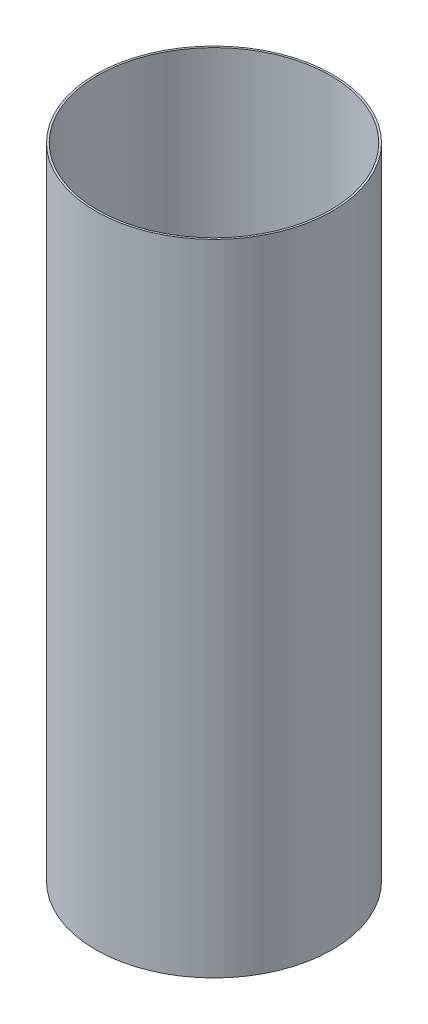
ISO-10303-21;
HEADER;
FILE_DESCRIPTION(('STEP AP214'),'2;1');
FILE_NAME('part.step','',(''),(''),'','','');
FILE_SCHEMA(('AUTOMOTIVE_DESIGN { 1 0 10303 214 1 1 1 1 }'));
ENDSEC;
DATA;
#1=APPLICATION_CONTEXT('core data for automotive mechanical design processes');
#2=APPLICATION_PROTOCOL_DEFINITION('international standard','automotive_design',2000,#1);
#3=PRODUCT_CONTEXT('',#1,'mechanical');
#4=PRODUCT('Part','Part','',(#3));
#5=PRODUCT_RELATED_PRODUCT_CATEGORY('part','',(#4));
#6=PRODUCT_DEFINITION_FORMATION('','',#4);
#7=PRODUCT_DEFINITION_CONTEXT('part definition',#1,'design');
#8=PRODUCT_DEFINITION('design','',#6,#7);
#9=PRODUCT_DEFINITION_SHAPE('','',#8);
#10=(LENGTH_UNIT() NAMED_UNIT(*) SI_UNIT(.MILLI.,.METRE.));
#11=(NAMED_UNIT(*) PLANE_ANGLE_UNIT() SI_UNIT($,.RADIAN.));
#12=(NAMED_UNIT(*) SI_UNIT($,.STERADIAN.) SOLID_ANGLE_UNIT());
#13=UNCERTAINTY_MEASURE_WITH_UNIT(LENGTH_MEASURE(1.E-05),#10,'distance_accuracy_value','');
#14=(GEOMETRIC_REPRESENTATION_CONTEXT(3) GLOBAL_UNCERTAINTY_ASSIGNED_CONTEXT((#13)) GLOBAL_UNIT_ASSIGNED_CONTEXT((#10,
#11,#12)) REPRESENTATION_CONTEXT('',''));
#15=CARTESIAN_POINT('',(0.,0.,0.));
#16=DIRECTION('',(0.,0.,1.));
#17=DIRECTION('',(1.,0.,0.));
#18=AXIS2_PLACEMENT_3D('',#15,#16,#17);
#19=CARTESIAN_POINT('',(0.,133.,0.));
#20=DIRECTION('',(0.,1.,0.));
#21=DIRECTION('',(0.,0.,1.));
#22=AXIS2_PLACEMENT_3D('',#19,#20,#21);
#23=PLANE('',#22);
#24=CARTESIAN_POINT('',(0.,133.,0.));
#25=DIRECTION('',(0.,1.,0.));
#26=DIRECTION('',(0.,0.,1.));
#27=AXIS2_PLACEMENT_3D('',#24,#25,#26);
#28=CIRCLE('',#27,24.63);
#29=CARTESIAN_POINT('',(0.,133.,24.63));
#30=VERTEX_POINT('',#29);
#31=EDGE_CURVE('E10',#30,#30,#28,.T.);
#32=ORIENTED_EDGE('',*,*,#31,.T.);
#33=EDGE_LOOP('',(#32));
#34=FACE_BOUND('',#33,.T.);
#35=CARTESIAN_POINT('',(0.,133.,0.));
#36=DIRECTION('',(0.,1.,0.));
#37=DIRECTION('',(0.,0.,1.));
#38=AXIS2_PLACEMENT_3D('',#35,#36,#37);
#39=CIRCLE('',#38,24.23);
#40=CARTESIAN_POINT('',(0.,133.,24.23));
#41=VERTEX_POINT('',#40);
#42=EDGE_CURVE('E52',#41,#41,#39,.T.);
#43=ORIENTED_EDGE('',*,*,#42,.F.);
#44=EDGE_LOOP('',(#43));
#45=FACE_BOUND('',#44,.T.);
#46=ADVANCED_FACE('F41',(#34,#45),#23,.T.);
#47=CARTESIAN_POINT('',(0.,0.,0.));
#48=DIRECTION('',(0.,1.,0.));
#49=DIRECTION('',(0.,0.,1.));
#50=AXIS2_PLACEMENT_3D('',#47,#48,#49);
#51=PLANE('',#50);
#52=CARTESIAN_POINT('',(0.,0.,0.));
#53=DIRECTION('',(0.,1.,0.));
#54=DIRECTION('',(0.,0.,1.));
#55=AXIS2_PLACEMENT_3D('',#52,#53,#54);
#56=CIRCLE('',#55,24.63);
#57=CARTESIAN_POINT('',(0.,0.,24.63));
#58=VERTEX_POINT('',#57);
#59=EDGE_CURVE('E45',#58,#58,#56,.T.);
#60=ORIENTED_EDGE('',*,*,#59,.F.);
#61=EDGE_LOOP('',(#60));
#62=FACE_BOUND('',#61,.T.);
#63=CARTESIAN_POINT('',(0.,0.,0.));
#64=DIRECTION('',(0.,1.,0.));
#65=DIRECTION('',(0.,0.,1.));
#66=AXIS2_PLACEMENT_3D('',#63,#64,#65);
#67=CIRCLE('',#66,24.23);
#68=CARTESIAN_POINT('',(0.,0.,24.23));
#69=VERTEX_POINT('',#68);
#70=EDGE_CURVE('E54',#69,#69,#67,.T.);
#71=ORIENTED_EDGE('',*,*,#70,.T.);
#72=EDGE_LOOP('',(#71));
#73=FACE_BOUND('',#72,.T.);
#74=ADVANCED_FACE('F64',(#62,#73),#51,.F.);
#75=CARTESIAN_POINT('',(0.,133.,0.));
#76=DIRECTION('',(0.,-1.,0.));
#77=DIRECTION('',(0.,0.,-1.));
#78=AXIS2_PLACEMENT_3D('',#75,#76,#77);
#79=CYLINDRICAL_SURFACE('',#78,24.63);
#80=ORIENTED_EDGE('',*,*,#31,.F.);
#81=EDGE_LOOP('',(#80));
#82=FACE_BOUND('',#81,.T.);
#83=ORIENTED_EDGE('',*,*,#59,.T.);
#84=EDGE_LOOP('',(#83));
#85=FACE_BOUND('',#84,.T.);
#86=ADVANCED_FACE('F43',(#82,#85),#79,.T.);
#87=CARTESIAN_POINT('',(0.,133.,0.));
#88=DIRECTION('',(0.,-1.,0.));
#89=DIRECTION('',(0.,0.,-1.));
#90=AXIS2_PLACEMENT_3D('',#87,#88,#89);
#91=CYLINDRICAL_SURFACE('',#90,24.23);
#92=ORIENTED_EDGE('',*,*,#42,.T.);
#93=EDGE_LOOP('',(#92));
#94=FACE_BOUND('',#93,.T.);
#95=ORIENTED_EDGE('',*,*,#70,.F.);
#96=EDGE_LOOP('',(#95));
#97=FACE_BOUND('',#96,.T.);
#98=ADVANCED_FACE('F60',(#94,#97),#91,.F.);
#99=CLOSED_SHELL('',(#46,#74,#86,#98));
#100=MANIFOLD_SOLID_BREP('B2',#99);
#101=ADVANCED_BREP_SHAPE_REPRESENTATION('',(#18,#100),#14);
#102=SHAPE_DEFINITION_REPRESENTATION(#9,#101);
ENDSEC;
END-ISO-10303-21;
